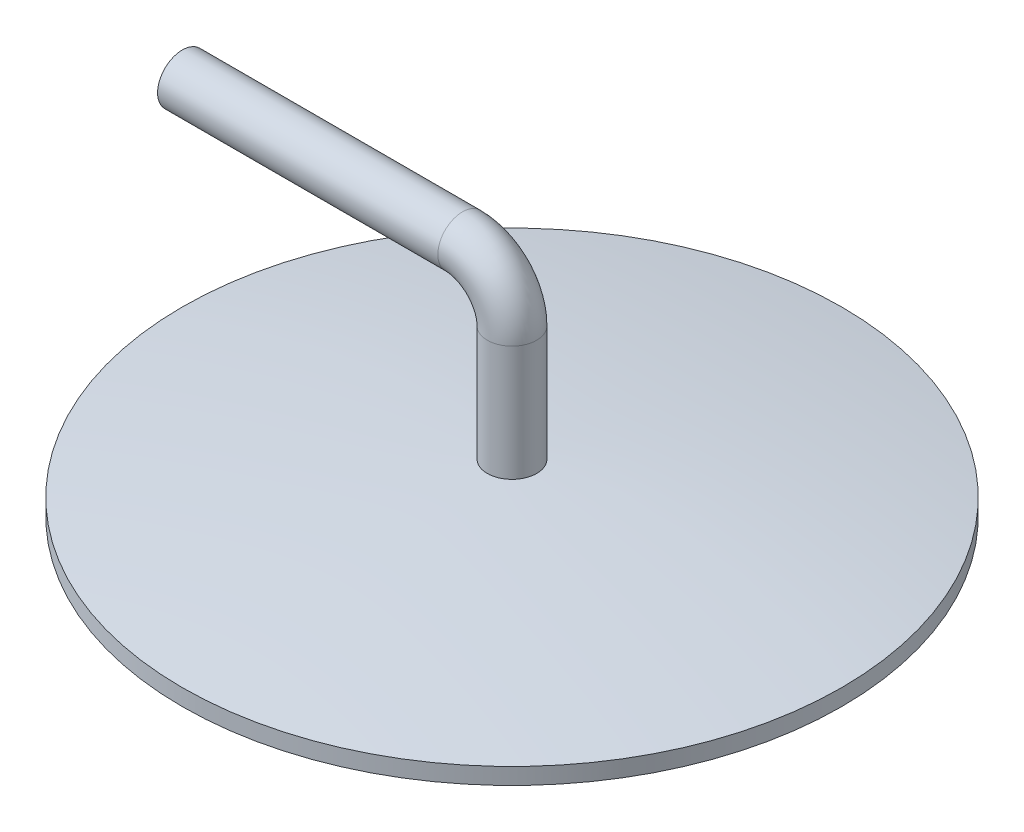
ISO-10303-21;
HEADER;
FILE_DESCRIPTION(('STEP AP214'),'2;1');
FILE_NAME('part.step','',(''),(''),'','','');
FILE_SCHEMA(('AUTOMOTIVE_DESIGN { 1 0 10303 214 1 1 1 1 }'));
ENDSEC;
DATA;
#1=APPLICATION_CONTEXT('core data for automotive mechanical design processes');
#2=APPLICATION_PROTOCOL_DEFINITION('international standard','automotive_design',2000,#1);
#3=PRODUCT_CONTEXT('',#1,'mechanical');
#4=PRODUCT('Part','Part','',(#3));
#5=PRODUCT_RELATED_PRODUCT_CATEGORY('part','',(#4));
#6=PRODUCT_DEFINITION_FORMATION('','',#4);
#7=PRODUCT_DEFINITION_CONTEXT('part definition',#1,'design');
#8=PRODUCT_DEFINITION('design','',#6,#7);
#9=PRODUCT_DEFINITION_SHAPE('','',#8);
#10=(LENGTH_UNIT() NAMED_UNIT(*) SI_UNIT(.MILLI.,.METRE.));
#11=(NAMED_UNIT(*) PLANE_ANGLE_UNIT() SI_UNIT($,.RADIAN.));
#12=(NAMED_UNIT(*) SI_UNIT($,.STERADIAN.) SOLID_ANGLE_UNIT());
#13=UNCERTAINTY_MEASURE_WITH_UNIT(LENGTH_MEASURE(1.E-05),#10,'distance_accuracy_value','');
#14=(GEOMETRIC_REPRESENTATION_CONTEXT(3) GLOBAL_UNCERTAINTY_ASSIGNED_CONTEXT((#13)) GLOBAL_UNIT_ASSIGNED_CONTEXT((#10,
#11,#12)) REPRESENTATION_CONTEXT('',''));
#15=CARTESIAN_POINT('',(0.,0.,0.));
#16=DIRECTION('',(0.,0.,1.));
#17=DIRECTION('',(1.,0.,0.));
#18=AXIS2_PLACEMENT_3D('',#15,#16,#17);
#19=CARTESIAN_POINT('',(0.,-1354.72954007881,0.));
#20=DIRECTION('',(0.,1.,0.));
#21=DIRECTION('',(0.,0.,1.));
#22=AXIS2_PLACEMENT_3D('',#19,#20,#21);
#23=DEGENERATE_TOROIDAL_SURFACE('',#22,41.1194097382501,1385.86625881297,.F.);
#24=CARTESIAN_POINT('',(0.,9.99999999999997,0.));
#25=DIRECTION('',(0.,1.,0.));
#26=DIRECTION('',(0.,0.,1.));
#27=AXIS2_PLACEMENT_3D('',#24,#25,#26);
#28=CIRCLE('',#27,200.);
#29=CARTESIAN_POINT('',(0.,9.99999999999997,200.));
#30=VERTEX_POINT('',#29);
#31=EDGE_CURVE('E53',#30,#30,#28,.T.);
#32=ORIENTED_EDGE('',*,*,#31,.T.);
#33=EDGE_LOOP('',(#32));
#34=FACE_BOUND('',#33,.T.);
#35=CARTESIAN_POINT('',(0.,30.,0.));
#36=DIRECTION('',(0.,1.,0.));
#37=DIRECTION('',(0.,0.,1.));
#38=AXIS2_PLACEMENT_3D('',#35,#36,#37);
#39=CIRCLE('',#38,15.);
#40=CARTESIAN_POINT('',(0.,30.,15.));
#41=VERTEX_POINT('',#40);
#42=EDGE_CURVE('E43',#41,#41,#39,.T.);
#43=ORIENTED_EDGE('',*,*,#42,.F.);
#44=EDGE_LOOP('',(#43));
#45=FACE_BOUND('',#44,.T.);
#46=ADVANCED_FACE('F39',(#34,#45),#23,.F.);
#47=CARTESIAN_POINT('',(0.,30.,0.));
#48=DIRECTION('',(0.,1.,0.));
#49=DIRECTION('',(0.,0.,1.));
#50=AXIS2_PLACEMENT_3D('',#47,#48,#49);
#51=CYLINDRICAL_SURFACE('',#50,200.);
#52=ORIENTED_EDGE('',*,*,#31,.F.);
#53=EDGE_LOOP('',(#52));
#54=FACE_BOUND('',#53,.T.);
#55=CARTESIAN_POINT('',(0.,0.,0.));
#56=DIRECTION('',(0.,1.,0.));
#57=DIRECTION('',(0.,0.,1.));
#58=AXIS2_PLACEMENT_3D('',#55,#56,#57);
#59=CIRCLE('',#58,200.);
#60=CARTESIAN_POINT('',(0.,0.,200.));
#61=VERTEX_POINT('',#60);
#62=EDGE_CURVE('E68',#61,#61,#59,.T.);
#63=ORIENTED_EDGE('',*,*,#62,.T.);
#64=EDGE_LOOP('',(#63));
#65=FACE_BOUND('',#64,.T.);
#66=ADVANCED_FACE('F88',(#54,#65),#51,.T.);
#67=CARTESIAN_POINT('',(0.,0.,0.));
#68=DIRECTION('',(0.,1.,0.));
#69=DIRECTION('',(0.,0.,1.));
#70=AXIS2_PLACEMENT_3D('',#67,#68,#69);
#71=PLANE('',#70);
#72=ORIENTED_EDGE('',*,*,#62,.F.);
#73=EDGE_LOOP('',(#72));
#74=FACE_BOUND('',#73,.T.);
#75=ADVANCED_FACE('F91',(#74),#71,.F.);
#76=CARTESIAN_POINT('',(0.,30.,0.));
#77=DIRECTION('',(0.,1.,0.));
#78=DIRECTION('',(0.,0.,1.));
#79=AXIS2_PLACEMENT_3D('',#76,#77,#78);
#80=CYLINDRICAL_SURFACE('',#79,15.);
#81=CARTESIAN_POINT('',(0.,99.9999999999998,0.));
#82=DIRECTION('',(0.,1.,0.));
#83=DIRECTION('',(0.,0.,1.));
#84=AXIS2_PLACEMENT_3D('',#81,#82,#83);
#85=CIRCLE('',#84,15.);
#86=CARTESIAN_POINT('',(14.9999999999998,99.9999999999997,0.));
#87=VERTEX_POINT('',#86);
#88=EDGE_CURVE('E73',#87,#87,#85,.T.);
#89=ORIENTED_EDGE('',*,*,#88,.F.);
#90=EDGE_LOOP('',(#89));
#91=FACE_BOUND('',#90,.T.);
#92=ORIENTED_EDGE('',*,*,#42,.T.);
#93=EDGE_LOOP('',(#92));
#94=FACE_BOUND('',#93,.T.);
#95=ADVANCED_FACE('F96',(#91,#94),#80,.T.);
#96=CARTESIAN_POINT('',(-30.,100.,0.));
#97=DIRECTION('',(0.,0.,1.));
#98=DIRECTION('',(1.,0.,0.));
#99=AXIS2_PLACEMENT_3D('',#96,#97,#98);
#100=TOROIDAL_SURFACE('',#99,29.9999999999998,15.);
#101=CARTESIAN_POINT('',(-30.0000000000002,130.,0.));
#102=DIRECTION('',(-1.,0.,0.));
#103=DIRECTION('',(0.,0.,1.));
#104=AXIS2_PLACEMENT_3D('',#101,#102,#103);
#105=CIRCLE('',#104,15.);
#106=CARTESIAN_POINT('',(-30.0000000000003,145.,0.));
#107=VERTEX_POINT('',#106);
#108=EDGE_CURVE('E72',#107,#107,#105,.T.);
#109=CARTESIAN_POINT('',(-30.,100.,0.));
#110=DIRECTION('',(0.,0.,1.));
#111=DIRECTION('',(1.,0.,0.));
#112=AXIS2_PLACEMENT_3D('',#109,#110,#111);
#113=CIRCLE('',#112,44.9999999999998);
#114=EDGE_CURVE('',#87,#107,#113,.T.);
#115=ORIENTED_EDGE('',*,*,#88,.T.);
#116=ORIENTED_EDGE('',*,*,#108,.F.);
#117=ORIENTED_EDGE('',*,*,#114,.T.);
#118=ORIENTED_EDGE('',*,*,#114,.F.);
#119=EDGE_LOOP('',(#115,#117,#116,#118));
#120=FACE_BOUND('',#119,.T.);
#121=ADVANCED_FACE('F102',(#120),#100,.T.);
#122=CARTESIAN_POINT('',(-30.0000000000002,130.,0.));
#123=DIRECTION('',(-1.,0.,0.));
#124=DIRECTION('',(0.,-1.,0.));
#125=AXIS2_PLACEMENT_3D('',#122,#123,#124);
#126=CYLINDRICAL_SURFACE('',#125,15.);
#127=CARTESIAN_POINT('',(-200.,130.,0.));
#128=DIRECTION('',(-1.,0.,0.));
#129=DIRECTION('',(0.,0.,1.));
#130=AXIS2_PLACEMENT_3D('',#127,#128,#129);
#131=CIRCLE('',#130,15.);
#132=CARTESIAN_POINT('',(-200.,130.,15.));
#133=VERTEX_POINT('',#132);
#134=EDGE_CURVE('E60',#133,#133,#131,.T.);
#135=ORIENTED_EDGE('',*,*,#134,.F.);
#136=EDGE_LOOP('',(#135));
#137=FACE_BOUND('',#136,.T.);
#138=ORIENTED_EDGE('',*,*,#108,.T.);
#139=EDGE_LOOP('',(#138));
#140=FACE_BOUND('',#139,.T.);
#141=ADVANCED_FACE('F139',(#137,#140),#126,.T.);
#142=CARTESIAN_POINT('',(-200.,130.,0.));
#143=DIRECTION('',(-1.,0.,0.));
#144=DIRECTION('',(0.,0.,1.));
#145=AXIS2_PLACEMENT_3D('',#142,#143,#144);
#146=PLANE('',#145);
#147=CARTESIAN_POINT('',(-200.,130.,0.));
#148=DIRECTION('',(-1.,0.,0.));
#149=DIRECTION('',(0.,0.,1.));
#150=AXIS2_PLACEMENT_3D('',#147,#148,#149);
#151=CIRCLE('',#150,10.);
#152=CARTESIAN_POINT('',(-200.,130.,10.));
#153=VERTEX_POINT('',#152);
#154=EDGE_CURVE('E64',#153,#153,#151,.F.);
#155=ORIENTED_EDGE('',*,*,#154,.T.);
#156=EDGE_LOOP('',(#155));
#157=FACE_BOUND('',#156,.T.);
#158=ORIENTED_EDGE('',*,*,#134,.T.);
#159=EDGE_LOOP('',(#158));
#160=FACE_BOUND('',#159,.T.);
#161=ADVANCED_FACE('F149',(#157,#160),#146,.T.);
#162=CARTESIAN_POINT('',(0.,30.,0.));
#163=DIRECTION('',(0.,1.,0.));
#164=DIRECTION('',(0.,0.,1.));
#165=AXIS2_PLACEMENT_3D('',#162,#163,#164);
#166=CYLINDRICAL_SURFACE('',#165,10.);
#167=CARTESIAN_POINT('',(0.,99.9999999999998,0.));
#168=DIRECTION('',(0.,1.,0.));
#169=DIRECTION('',(0.,0.,1.));
#170=AXIS2_PLACEMENT_3D('',#167,#168,#169);
#171=CIRCLE('',#170,10.);
#172=CARTESIAN_POINT('',(9.99999999999978,99.9999999999997,0.));
#173=VERTEX_POINT('',#172);
#174=EDGE_CURVE('E55',#173,#173,#171,.F.);
#175=ORIENTED_EDGE('',*,*,#174,.F.);
#176=EDGE_LOOP('',(#175));
#177=FACE_BOUND('',#176,.T.);
#178=CARTESIAN_POINT('',(0.,30.,0.));
#179=DIRECTION('',(0.,1.,0.));
#180=DIRECTION('',(0.,0.,1.));
#181=AXIS2_PLACEMENT_3D('',#178,#179,#180);
#182=CIRCLE('',#181,10.);
#183=CARTESIAN_POINT('',(0.,30.,10.));
#184=VERTEX_POINT('',#183);
#185=EDGE_CURVE('E10',#184,#184,#182,.F.);
#186=ORIENTED_EDGE('',*,*,#185,.T.);
#187=EDGE_LOOP('',(#186));
#188=FACE_BOUND('',#187,.T.);
#189=ADVANCED_FACE('F158',(#177,#188),#166,.F.);
#190=CARTESIAN_POINT('',(-30.,100.,0.));
#191=DIRECTION('',(0.,0.,1.));
#192=DIRECTION('',(1.,0.,0.));
#193=AXIS2_PLACEMENT_3D('',#190,#191,#192);
#194=TOROIDAL_SURFACE('',#193,29.9999999999998,10.);
#195=CARTESIAN_POINT('',(-30.0000000000002,130.,0.));
#196=DIRECTION('',(-1.,0.,0.));
#197=DIRECTION('',(0.,0.,1.));
#198=AXIS2_PLACEMENT_3D('',#195,#196,#197);
#199=CIRCLE('',#198,10.);
#200=CARTESIAN_POINT('',(-30.0000000000003,140.,0.));
#201=VERTEX_POINT('',#200);
#202=EDGE_CURVE('E59',#201,#201,#199,.F.);
#203=CARTESIAN_POINT('',(-30.,100.,0.));
#204=DIRECTION('',(0.,0.,1.));
#205=DIRECTION('',(1.,0.,0.));
#206=AXIS2_PLACEMENT_3D('',#203,#204,#205);
#207=CIRCLE('',#206,39.9999999999998);
#208=EDGE_CURVE('',#173,#201,#207,.T.);
#209=ORIENTED_EDGE('',*,*,#174,.T.);
#210=ORIENTED_EDGE('',*,*,#202,.F.);
#211=ORIENTED_EDGE('',*,*,#208,.T.);
#212=ORIENTED_EDGE('',*,*,#208,.F.);
#213=EDGE_LOOP('',(#209,#211,#210,#212));
#214=FACE_BOUND('',#213,.T.);
#215=ADVANCED_FACE('F107',(#214),#194,.F.);
#216=CARTESIAN_POINT('',(-30.0000000000002,130.,0.));
#217=DIRECTION('',(-1.,0.,0.));
#218=DIRECTION('',(0.,-1.,0.));
#219=AXIS2_PLACEMENT_3D('',#216,#217,#218);
#220=CYLINDRICAL_SURFACE('',#219,10.);
#221=ORIENTED_EDGE('',*,*,#154,.F.);
#222=EDGE_LOOP('',(#221));
#223=FACE_BOUND('',#222,.T.);
#224=ORIENTED_EDGE('',*,*,#202,.T.);
#225=EDGE_LOOP('',(#224));
#226=FACE_BOUND('',#225,.T.);
#227=ADVANCED_FACE('F98',(#223,#226),#220,.F.);
#228=CARTESIAN_POINT('',(0.,30.,0.));
#229=DIRECTION('',(0.,1.,0.));
#230=DIRECTION('',(0.,0.,1.));
#231=AXIS2_PLACEMENT_3D('',#228,#229,#230);
#232=PLANE('',#231);
#233=ORIENTED_EDGE('',*,*,#185,.F.);
#234=EDGE_LOOP('',(#233));
#235=FACE_BOUND('',#234,.T.);
#236=ADVANCED_FACE('F41',(#235),#232,.T.);
#237=CLOSED_SHELL('',(#46,#66,#75,#95,#121,#141,#161,#189,#215,#227,#236));
#238=MANIFOLD_SOLID_BREP('B2',#237);
#239=ADVANCED_BREP_SHAPE_REPRESENTATION('',(#18,#238),#14);
#240=SHAPE_DEFINITION_REPRESENTATION(#9,#239);
ENDSEC;
END-ISO-10303-21;
